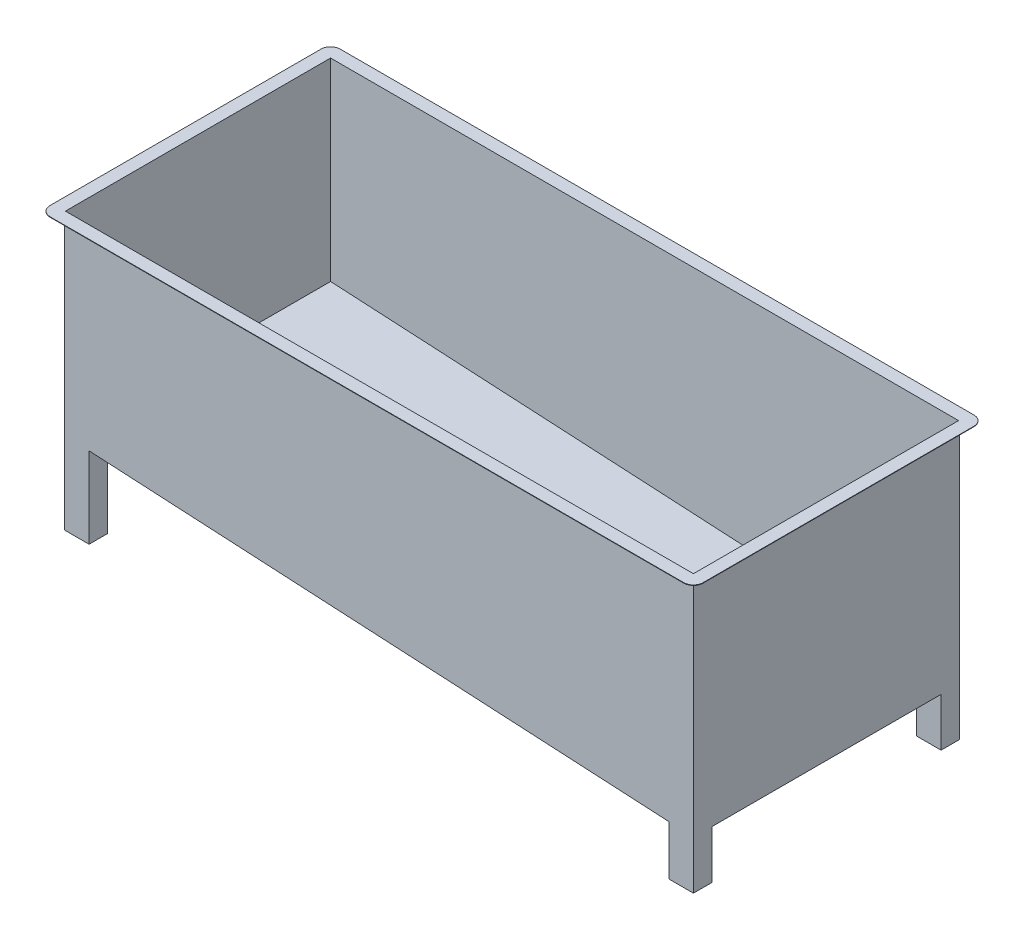
ISO-10303-21;
HEADER;
FILE_DESCRIPTION(('STEP AP214'),'2;1');
FILE_NAME('part.step','',(''),(''),'','','');
FILE_SCHEMA(('AUTOMOTIVE_DESIGN { 1 0 10303 214 1 1 1 1 }'));
ENDSEC;
DATA;
#1=APPLICATION_CONTEXT('core data for automotive mechanical design processes');
#2=APPLICATION_PROTOCOL_DEFINITION('international standard','automotive_design',2000,#1);
#3=PRODUCT_CONTEXT('',#1,'mechanical');
#4=PRODUCT('Part','Part','',(#3));
#5=PRODUCT_RELATED_PRODUCT_CATEGORY('part','',(#4));
#6=PRODUCT_DEFINITION_FORMATION('','',#4);
#7=PRODUCT_DEFINITION_CONTEXT('part definition',#1,'design');
#8=PRODUCT_DEFINITION('design','',#6,#7);
#9=PRODUCT_DEFINITION_SHAPE('','',#8);
#10=(LENGTH_UNIT() NAMED_UNIT(*) SI_UNIT(.MILLI.,.METRE.));
#11=(NAMED_UNIT(*) PLANE_ANGLE_UNIT() SI_UNIT($,.RADIAN.));
#12=(NAMED_UNIT(*) SI_UNIT($,.STERADIAN.) SOLID_ANGLE_UNIT());
#13=UNCERTAINTY_MEASURE_WITH_UNIT(LENGTH_MEASURE(1.E-05),#10,'distance_accuracy_value','');
#14=(GEOMETRIC_REPRESENTATION_CONTEXT(3) GLOBAL_UNCERTAINTY_ASSIGNED_CONTEXT((#13)) GLOBAL_UNIT_ASSIGNED_CONTEXT((#10,
#11,#12)) REPRESENTATION_CONTEXT('',''));
#15=CARTESIAN_POINT('',(0.,0.,0.));
#16=DIRECTION('',(0.,0.,1.));
#17=DIRECTION('',(1.,0.,0.));
#18=AXIS2_PLACEMENT_3D('',#15,#16,#17);
#19=CARTESIAN_POINT('',(1300.,0.,3153.76650258813));
#20=DIRECTION('',(0.0537682621928045,0.998553440723513,0.));
#21=DIRECTION('',(-0.998553440723513,0.0537682621928045,0.));
#22=AXIS2_PLACEMENT_3D('',#19,#20,#21);
#23=PLANE('',#22);
#24=CARTESIAN_POINT('',(1250.,2.69230769230772,300.));
#25=DIRECTION('',(0.0537682621928045,0.998553440723513,0.));
#26=DIRECTION('',(0.998553440723513,-0.0537682621928045,0.));
#27=AXIS2_PLACEMENT_3D('',#24,#25,#26);
#28=ELLIPSE('',#27,12.718397916488,12.6999999999999);
#29=CARTESIAN_POINT('',(1262.7,2.00846153846157,300.));
#30=VERTEX_POINT('',#29);
#31=EDGE_CURVE('E441',#30,#30,#28,.T.);
#32=ORIENTED_EDGE('',*,*,#31,.T.);
#33=EDGE_LOOP('',(#32));
#34=FACE_BOUND('',#33,.T.);
#35=CARTESIAN_POINT('',(1250.,2.69230769230772,0.));
#36=DIRECTION('',(0.0537682621928045,0.998553440723513,0.));
#37=DIRECTION('',(0.998553440723513,-0.0537682621928045,0.));
#38=AXIS2_PLACEMENT_3D('',#35,#36,#37);
#39=ELLIPSE('',#38,12.718397916488,12.6999999999999);
#40=CARTESIAN_POINT('',(1262.7,2.00846153846157,0.));
#41=VERTEX_POINT('',#40);
#42=EDGE_CURVE('E252',#41,#41,#39,.T.);
#43=ORIENTED_EDGE('',*,*,#42,.T.);
#44=EDGE_LOOP('',(#43));
#45=FACE_BOUND('',#44,.T.);
#46=DIRECTION('',(-0.998553440723513,0.0537682621928045,0.));
#47=VECTOR('',#46,1.);
#48=CARTESIAN_POINT('',(1300.,0.,550.));
#49=LINE('',#48,#47);
#50=CARTESIAN_POINT('',(1198.4,5.47076923076924,550.));
#51=VERTEX_POINT('',#50);
#52=CARTESIAN_POINT('',(-1198.4,134.529230769231,550.));
#53=VERTEX_POINT('',#52);
#54=EDGE_CURVE('E57',#51,#53,#49,.T.);
#55=ORIENTED_EDGE('',*,*,#54,.T.);
#56=DIRECTION('',(0.,0.,1.));
#57=VECTOR('',#56,1.);
#58=CARTESIAN_POINT('',(-1198.4,134.529230769231,473.8));
#59=LINE('',#58,#57);
#60=CARTESIAN_POINT('',(-1198.4,134.529230769231,473.8));
#61=VERTEX_POINT('',#60);
#62=EDGE_CURVE('E52',#61,#53,#59,.T.);
#63=ORIENTED_EDGE('',*,*,#62,.F.);
#64=DIRECTION('',(-0.998553440723513,0.0537682621928045,0.));
#65=VECTOR('',#64,1.);
#66=CARTESIAN_POINT('',(-1198.4,134.529230769231,473.8));
#67=LINE('',#66,#65);
#68=CARTESIAN_POINT('',(-1300.,140.,473.8));
#69=VERTEX_POINT('',#68);
#70=EDGE_CURVE('E232',#61,#69,#67,.T.);
#71=ORIENTED_EDGE('',*,*,#70,.T.);
#72=DIRECTION('',(0.,0.,-1.));
#73=VECTOR('',#72,1.);
#74=CARTESIAN_POINT('',(-1300.,140.,3153.76650258813));
#75=LINE('',#74,#73);
#76=CARTESIAN_POINT('',(-1300.,140.,-473.8));
#77=VERTEX_POINT('',#76);
#78=EDGE_CURVE('E222',#69,#77,#75,.T.);
#79=ORIENTED_EDGE('',*,*,#78,.T.);
#80=DIRECTION('',(0.998553440723513,-0.0537682621928045,0.));
#81=VECTOR('',#80,1.);
#82=CARTESIAN_POINT('',(-1300.,140.,-473.8));
#83=LINE('',#82,#81);
#84=CARTESIAN_POINT('',(-1198.4,134.529230769231,-473.8));
#85=VERTEX_POINT('',#84);
#86=EDGE_CURVE('E284',#77,#85,#83,.T.);
#87=ORIENTED_EDGE('',*,*,#86,.T.);
#88=DIRECTION('',(0.,0.,-1.));
#89=VECTOR('',#88,1.);
#90=CARTESIAN_POINT('',(-1198.4,134.529230769231,-473.8));
#91=LINE('',#90,#89);
#92=CARTESIAN_POINT('',(-1198.4,134.529230769231,-550.));
#93=VERTEX_POINT('',#92);
#94=EDGE_CURVE('E294',#85,#93,#91,.T.);
#95=ORIENTED_EDGE('',*,*,#94,.T.);
#96=DIRECTION('',(0.998553440723513,-0.0537682621928045,0.));
#97=VECTOR('',#96,1.);
#98=CARTESIAN_POINT('',(1300.,0.,-550.));
#99=LINE('',#98,#97);
#100=CARTESIAN_POINT('',(1198.4,5.47076923076923,-550.));
#101=VERTEX_POINT('',#100);
#102=EDGE_CURVE('E230',#93,#101,#99,.T.);
#103=ORIENTED_EDGE('',*,*,#102,.T.);
#104=DIRECTION('',(0.,0.,-1.));
#105=VECTOR('',#104,1.);
#106=CARTESIAN_POINT('',(1198.4,5.47076923076923,-473.8));
#107=LINE('',#106,#105);
#108=CARTESIAN_POINT('',(1198.4,5.47076923076923,-473.8));
#109=VERTEX_POINT('',#108);
#110=EDGE_CURVE('E325',#109,#101,#107,.T.);
#111=ORIENTED_EDGE('',*,*,#110,.F.);
#112=DIRECTION('',(0.998553440723513,-0.0537682621928045,0.));
#113=VECTOR('',#112,1.);
#114=CARTESIAN_POINT('',(1300.,0.,-473.8));
#115=LINE('',#114,#113);
#116=CARTESIAN_POINT('',(1300.,0.,-473.8));
#117=VERTEX_POINT('',#116);
#118=EDGE_CURVE('E307',#109,#117,#115,.T.);
#119=ORIENTED_EDGE('',*,*,#118,.T.);
#120=DIRECTION('',(0.,0.,-1.));
#121=VECTOR('',#120,1.);
#122=CARTESIAN_POINT('',(1300.,0.,550.));
#123=LINE('',#122,#121);
#124=CARTESIAN_POINT('',(1300.,0.,473.8));
#125=VERTEX_POINT('',#124);
#126=EDGE_CURVE('E398',#125,#117,#123,.T.);
#127=ORIENTED_EDGE('',*,*,#126,.F.);
#128=DIRECTION('',(-0.998553440723513,0.0537682621928046,0.));
#129=VECTOR('',#128,1.);
#130=CARTESIAN_POINT('',(1198.4,5.47076923076924,473.8));
#131=LINE('',#130,#129);
#132=CARTESIAN_POINT('',(1198.4,5.47076923076924,473.8));
#133=VERTEX_POINT('',#132);
#134=EDGE_CURVE('E260',#125,#133,#131,.T.);
#135=ORIENTED_EDGE('',*,*,#134,.T.);
#136=DIRECTION('',(0.,0.,1.));
#137=VECTOR('',#136,1.);
#138=CARTESIAN_POINT('',(1198.4,5.47076923076924,473.8));
#139=LINE('',#138,#137);
#140=EDGE_CURVE('E272',#133,#51,#139,.T.);
#141=ORIENTED_EDGE('',*,*,#140,.T.);
#142=EDGE_LOOP('',(#55,#63,#71,#79,#87,#95,#103,#111,#119,#127,#135,#141));
#143=FACE_BOUND('',#142,.T.);
#144=ADVANCED_FACE('F35',(#34,#45,#143),#23,.F.);
#145=CARTESIAN_POINT('',(0.,941.89,0.));
#146=DIRECTION('',(0.,1.,0.));
#147=DIRECTION('',(0.,0.,1.));
#148=AXIS2_PLACEMENT_3D('',#145,#146,#147);
#149=PLANE('',#148);
#150=DIRECTION('',(0.,0.,1.));
#151=VECTOR('',#150,1.);
#152=CARTESIAN_POINT('',(-1298.11,941.89,-548.11));
#153=LINE('',#152,#151);
#154=CARTESIAN_POINT('',(-1298.11,941.89,-548.11));
#155=VERTEX_POINT('',#154);
#156=CARTESIAN_POINT('',(-1298.11,941.89,548.11));
#157=VERTEX_POINT('',#156);
#158=EDGE_CURVE('E380',#155,#157,#153,.T.);
#159=ORIENTED_EDGE('',*,*,#158,.F.);
#160=DIRECTION('',(-1.,0.,0.));
#161=VECTOR('',#160,1.);
#162=CARTESIAN_POINT('',(-1298.11,941.89,-548.11));
#163=LINE('',#162,#161);
#164=CARTESIAN_POINT('',(1298.11,941.89,-548.11));
#165=VERTEX_POINT('',#164);
#166=EDGE_CURVE('E368',#165,#155,#163,.T.);
#167=ORIENTED_EDGE('',*,*,#166,.F.);
#168=DIRECTION('',(0.,0.,-1.));
#169=VECTOR('',#168,1.);
#170=CARTESIAN_POINT('',(1298.11,941.89,-548.11));
#171=LINE('',#170,#169);
#172=CARTESIAN_POINT('',(1298.11,941.89,548.11));
#173=VERTEX_POINT('',#172);
#174=EDGE_CURVE('E385',#173,#165,#171,.T.);
#175=ORIENTED_EDGE('',*,*,#174,.F.);
#176=DIRECTION('',(1.,0.,0.));
#177=VECTOR('',#176,1.);
#178=CARTESIAN_POINT('',(-1298.11,941.89,548.11));
#179=LINE('',#178,#177);
#180=EDGE_CURVE('E382',#157,#173,#179,.T.);
#181=ORIENTED_EDGE('',*,*,#180,.F.);
#182=EDGE_LOOP('',(#159,#167,#175,#181));
#183=FACE_BOUND('',#182,.T.);
#184=DIRECTION('',(-1.,0.,0.));
#185=VECTOR('',#184,1.);
#186=CARTESIAN_POINT('',(-1350.,941.89,-600.));
#187=LINE('',#186,#185);
#188=CARTESIAN_POINT('',(1310.,941.89,-600.));
#189=VERTEX_POINT('',#188);
#190=CARTESIAN_POINT('',(-1310.,941.89,-600.));
#191=VERTEX_POINT('',#190);
#192=EDGE_CURVE('E354',#189,#191,#187,.T.);
#193=ORIENTED_EDGE('',*,*,#192,.T.);
#194=CARTESIAN_POINT('',(-1310.,941.89,-560.));
#195=DIRECTION('',(0.,1.,0.));
#196=DIRECTION('',(0.,0.,1.));
#197=AXIS2_PLACEMENT_3D('',#194,#195,#196);
#198=CIRCLE('',#197,40.);
#199=CARTESIAN_POINT('',(-1350.,941.89,-560.));
#200=VERTEX_POINT('',#199);
#201=EDGE_CURVE('E419',#191,#200,#198,.T.);
#202=ORIENTED_EDGE('',*,*,#201,.T.);
#203=DIRECTION('',(0.,0.,1.));
#204=VECTOR('',#203,1.);
#205=CARTESIAN_POINT('',(-1350.,941.89,-600.));
#206=LINE('',#205,#204);
#207=CARTESIAN_POINT('',(-1350.,941.89,560.));
#208=VERTEX_POINT('',#207);
#209=EDGE_CURVE('E371',#200,#208,#206,.T.);
#210=ORIENTED_EDGE('',*,*,#209,.T.);
#211=CARTESIAN_POINT('',(-1310.,941.89,560.));
#212=DIRECTION('',(0.,1.,0.));
#213=DIRECTION('',(0.,0.,1.));
#214=AXIS2_PLACEMENT_3D('',#211,#212,#213);
#215=CIRCLE('',#214,40.);
#216=CARTESIAN_POINT('',(-1310.,941.89,600.));
#217=VERTEX_POINT('',#216);
#218=EDGE_CURVE('E417',#208,#217,#215,.T.);
#219=ORIENTED_EDGE('',*,*,#218,.T.);
#220=DIRECTION('',(1.,0.,0.));
#221=VECTOR('',#220,1.);
#222=CARTESIAN_POINT('',(-1350.,941.89,600.));
#223=LINE('',#222,#221);
#224=CARTESIAN_POINT('',(1310.,941.89,600.));
#225=VERTEX_POINT('',#224);
#226=EDGE_CURVE('E374',#217,#225,#223,.T.);
#227=ORIENTED_EDGE('',*,*,#226,.T.);
#228=CARTESIAN_POINT('',(1310.,941.89,560.));
#229=DIRECTION('',(0.,1.,0.));
#230=DIRECTION('',(0.,0.,1.));
#231=AXIS2_PLACEMENT_3D('',#228,#229,#230);
#232=CIRCLE('',#231,40.);
#233=CARTESIAN_POINT('',(1350.,941.89,560.));
#234=VERTEX_POINT('',#233);
#235=EDGE_CURVE('E413',#225,#234,#232,.T.);
#236=ORIENTED_EDGE('',*,*,#235,.T.);
#237=DIRECTION('',(0.,0.,-1.));
#238=VECTOR('',#237,1.);
#239=CARTESIAN_POINT('',(1350.,941.89,-600.));
#240=LINE('',#239,#238);
#241=CARTESIAN_POINT('',(1350.,941.89,-560.));
#242=VERTEX_POINT('',#241);
#243=EDGE_CURVE('E359',#234,#242,#240,.T.);
#244=ORIENTED_EDGE('',*,*,#243,.T.);
#245=CARTESIAN_POINT('',(1310.,941.89,-560.));
#246=DIRECTION('',(0.,1.,0.));
#247=DIRECTION('',(0.,0.,1.));
#248=AXIS2_PLACEMENT_3D('',#245,#246,#247);
#249=CIRCLE('',#248,40.);
#250=EDGE_CURVE('E415',#242,#189,#249,.T.);
#251=ORIENTED_EDGE('',*,*,#250,.T.);
#252=EDGE_LOOP('',(#193,#202,#210,#219,#227,#236,#244,#251));
#253=FACE_BOUND('',#252,.T.);
#254=ADVANCED_FACE('F473',(#183,#253),#149,.T.);
#255=CARTESIAN_POINT('',(-1298.11,941.89,-548.11));
#256=DIRECTION('',(0.,0.,1.));
#257=DIRECTION('',(1.,0.,0.));
#258=AXIS2_PLACEMENT_3D('',#255,#256,#257);
#259=PLANE('',#258);
#260=DIRECTION('',(-0.998553440723513,0.0537682621928045,0.));
#261=VECTOR('',#260,1.);
#262=CARTESIAN_POINT('',(-1341.06770360839,144.104075844256,-548.11));
#263=LINE('',#262,#261);
#264=CARTESIAN_POINT('',(1298.11,1.99450718841976,-548.11));
#265=VERTEX_POINT('',#264);
#266=CARTESIAN_POINT('',(-1298.11,141.790968726881,-548.11));
#267=VERTEX_POINT('',#266);
#268=EDGE_CURVE('E341',#265,#267,#263,.T.);
#269=ORIENTED_EDGE('',*,*,#268,.F.);
#270=DIRECTION('',(0.,-1.,0.));
#271=VECTOR('',#270,1.);
#272=CARTESIAN_POINT('',(1298.11,941.89,-548.11));
#273=LINE('',#272,#271);
#274=EDGE_CURVE('E387',#165,#265,#273,.T.);
#275=ORIENTED_EDGE('',*,*,#274,.F.);
#276=ORIENTED_EDGE('',*,*,#166,.T.);
#277=DIRECTION('',(0.,-1.,0.));
#278=VECTOR('',#277,1.);
#279=CARTESIAN_POINT('',(-1298.11,941.89,-548.11));
#280=LINE('',#279,#278);
#281=EDGE_CURVE('E395',#155,#267,#280,.T.);
#282=ORIENTED_EDGE('',*,*,#281,.T.);
#283=EDGE_LOOP('',(#269,#275,#276,#282));
#284=FACE_BOUND('',#283,.T.);
#285=ADVANCED_FACE('F476',(#284),#259,.T.);
#286=CARTESIAN_POINT('',(-1298.11,941.89,-548.11));
#287=DIRECTION('',(1.,0.,0.));
#288=DIRECTION('',(0.,0.,-1.));
#289=AXIS2_PLACEMENT_3D('',#286,#287,#288);
#290=PLANE('',#289);
#291=DIRECTION('',(0.,0.,1.));
#292=VECTOR('',#291,1.);
#293=CARTESIAN_POINT('',(-1298.11,141.790968726881,-548.11));
#294=LINE('',#293,#292);
#295=CARTESIAN_POINT('',(-1298.11,141.790968726881,548.11));
#296=VERTEX_POINT('',#295);
#297=EDGE_CURVE('E338',#267,#296,#294,.T.);
#298=ORIENTED_EDGE('',*,*,#297,.F.);
#299=ORIENTED_EDGE('',*,*,#281,.F.);
#300=ORIENTED_EDGE('',*,*,#158,.T.);
#301=DIRECTION('',(0.,-1.,0.));
#302=VECTOR('',#301,1.);
#303=CARTESIAN_POINT('',(-1298.11,941.89,548.11));
#304=LINE('',#303,#302);
#305=EDGE_CURVE('E392',#157,#296,#304,.T.);
#306=ORIENTED_EDGE('',*,*,#305,.T.);
#307=EDGE_LOOP('',(#298,#299,#300,#306));
#308=FACE_BOUND('',#307,.T.);
#309=ADVANCED_FACE('F479',(#308),#290,.T.);
#310=CARTESIAN_POINT('',(-1298.11,941.89,548.11));
#311=DIRECTION('',(0.,0.,-1.));
#312=DIRECTION('',(-1.,0.,0.));
#313=AXIS2_PLACEMENT_3D('',#310,#311,#312);
#314=PLANE('',#313);
#315=DIRECTION('',(0.998553440723513,-0.0537682621928045,0.));
#316=VECTOR('',#315,1.);
#317=CARTESIAN_POINT('',(-1341.06770360839,144.104075844256,548.11));
#318=LINE('',#317,#316);
#319=CARTESIAN_POINT('',(1298.11,1.99450718841998,548.11));
#320=VERTEX_POINT('',#319);
#321=EDGE_CURVE('E335',#296,#320,#318,.T.);
#322=ORIENTED_EDGE('',*,*,#321,.F.);
#323=ORIENTED_EDGE('',*,*,#305,.F.);
#324=ORIENTED_EDGE('',*,*,#180,.T.);
#325=DIRECTION('',(0.,-1.,0.));
#326=VECTOR('',#325,1.);
#327=CARTESIAN_POINT('',(1298.11,941.89,548.11));
#328=LINE('',#327,#326);
#329=EDGE_CURVE('E389',#173,#320,#328,.T.);
#330=ORIENTED_EDGE('',*,*,#329,.T.);
#331=EDGE_LOOP('',(#322,#323,#324,#330));
#332=FACE_BOUND('',#331,.T.);
#333=ADVANCED_FACE('F466',(#332),#314,.T.);
#334=CARTESIAN_POINT('',(1298.11,941.89,-548.11));
#335=DIRECTION('',(-1.,0.,0.));
#336=DIRECTION('',(0.,0.,1.));
#337=AXIS2_PLACEMENT_3D('',#334,#335,#336);
#338=PLANE('',#337);
#339=DIRECTION('',(0.,0.,-1.));
#340=VECTOR('',#339,1.);
#341=CARTESIAN_POINT('',(1298.11,1.99450718841976,-548.11));
#342=LINE('',#341,#340);
#343=EDGE_CURVE('E328',#320,#265,#342,.T.);
#344=ORIENTED_EDGE('',*,*,#343,.F.);
#345=ORIENTED_EDGE('',*,*,#329,.F.);
#346=ORIENTED_EDGE('',*,*,#174,.T.);
#347=ORIENTED_EDGE('',*,*,#274,.T.);
#348=EDGE_LOOP('',(#344,#345,#346,#347));
#349=FACE_BOUND('',#348,.T.);
#350=ADVANCED_FACE('F463',(#349),#338,.T.);
#351=CARTESIAN_POINT('',(-1350.,940.,-600.));
#352=DIRECTION('',(0.,0.,-1.));
#353=DIRECTION('',(-1.,0.,0.));
#354=AXIS2_PLACEMENT_3D('',#351,#352,#353);
#355=PLANE('',#354);
#356=DIRECTION('',(-1.,0.,0.));
#357=VECTOR('',#356,1.);
#358=CARTESIAN_POINT('',(-1350.,940.,-600.));
#359=LINE('',#358,#357);
#360=CARTESIAN_POINT('',(1310.,940.,-600.));
#361=VERTEX_POINT('',#360);
#362=CARTESIAN_POINT('',(-1310.,940.,-600.));
#363=VERTEX_POINT('',#362);
#364=EDGE_CURVE('E355',#361,#363,#359,.T.);
#365=ORIENTED_EDGE('',*,*,#364,.T.);
#366=DIRECTION('',(0.,1.,0.));
#367=VECTOR('',#366,1.);
#368=CARTESIAN_POINT('',(-1310.,940.,-600.));
#369=LINE('',#368,#367);
#370=EDGE_CURVE('E410',#363,#191,#369,.T.);
#371=ORIENTED_EDGE('',*,*,#370,.T.);
#372=ORIENTED_EDGE('',*,*,#192,.F.);
#373=DIRECTION('',(0.,1.,0.));
#374=VECTOR('',#373,1.);
#375=CARTESIAN_POINT('',(1310.,940.,-600.));
#376=LINE('',#375,#374);
#377=EDGE_CURVE('E408',#189,#361,#376,.F.);
#378=ORIENTED_EDGE('',*,*,#377,.T.);
#379=EDGE_LOOP('',(#365,#371,#372,#378));
#380=FACE_BOUND('',#379,.T.);
#381=ADVANCED_FACE('F507',(#380),#355,.T.);
#382=CARTESIAN_POINT('',(1350.,940.,-600.));
#383=DIRECTION('',(1.,0.,0.));
#384=DIRECTION('',(0.,0.,-1.));
#385=AXIS2_PLACEMENT_3D('',#382,#383,#384);
#386=PLANE('',#385);
#387=DIRECTION('',(0.,0.,-1.));
#388=VECTOR('',#387,1.);
#389=CARTESIAN_POINT('',(1350.,940.,-600.));
#390=LINE('',#389,#388);
#391=CARTESIAN_POINT('',(1350.,940.,560.));
#392=VERTEX_POINT('',#391);
#393=CARTESIAN_POINT('',(1350.,940.,-560.));
#394=VERTEX_POINT('',#393);
#395=EDGE_CURVE('E365',#392,#394,#390,.T.);
#396=ORIENTED_EDGE('',*,*,#395,.T.);
#397=DIRECTION('',(0.,1.,0.));
#398=VECTOR('',#397,1.);
#399=CARTESIAN_POINT('',(1350.,940.,-560.));
#400=LINE('',#399,#398);
#401=EDGE_CURVE('E11',#394,#242,#400,.T.);
#402=ORIENTED_EDGE('',*,*,#401,.T.);
#403=ORIENTED_EDGE('',*,*,#243,.F.);
#404=DIRECTION('',(0.,1.,0.));
#405=VECTOR('',#404,1.);
#406=CARTESIAN_POINT('',(1350.,940.,560.));
#407=LINE('',#406,#405);
#408=EDGE_CURVE('E44',#234,#392,#407,.F.);
#409=ORIENTED_EDGE('',*,*,#408,.T.);
#410=EDGE_LOOP('',(#396,#402,#403,#409));
#411=FACE_BOUND('',#410,.T.);
#412=ADVANCED_FACE('F503',(#411),#386,.T.);
#413=CARTESIAN_POINT('',(-1350.,940.,600.));
#414=DIRECTION('',(0.,0.,1.));
#415=DIRECTION('',(1.,0.,0.));
#416=AXIS2_PLACEMENT_3D('',#413,#414,#415);
#417=PLANE('',#416);
#418=ORIENTED_EDGE('',*,*,#226,.F.);
#419=DIRECTION('',(0.,1.,0.));
#420=VECTOR('',#419,1.);
#421=CARTESIAN_POINT('',(-1310.,940.,600.));
#422=LINE('',#421,#420);
#423=CARTESIAN_POINT('',(-1310.,940.,600.));
#424=VERTEX_POINT('',#423);
#425=EDGE_CURVE('E437',#217,#424,#422,.F.);
#426=ORIENTED_EDGE('',*,*,#425,.T.);
#427=DIRECTION('',(1.,0.,0.));
#428=VECTOR('',#427,1.);
#429=CARTESIAN_POINT('',(-1350.,940.,600.));
#430=LINE('',#429,#428);
#431=CARTESIAN_POINT('',(1310.,940.,600.));
#432=VERTEX_POINT('',#431);
#433=EDGE_CURVE('E362',#424,#432,#430,.T.);
#434=ORIENTED_EDGE('',*,*,#433,.T.);
#435=DIRECTION('',(0.,1.,0.));
#436=VECTOR('',#435,1.);
#437=CARTESIAN_POINT('',(1310.,940.,600.));
#438=LINE('',#437,#436);
#439=EDGE_CURVE('E434',#432,#225,#438,.T.);
#440=ORIENTED_EDGE('',*,*,#439,.T.);
#441=EDGE_LOOP('',(#418,#426,#434,#440));
#442=FACE_BOUND('',#441,.T.);
#443=ADVANCED_FACE('F506',(#442),#417,.T.);
#444=CARTESIAN_POINT('',(-1350.,940.,-600.));
#445=DIRECTION('',(-1.,0.,0.));
#446=DIRECTION('',(0.,0.,1.));
#447=AXIS2_PLACEMENT_3D('',#444,#445,#446);
#448=PLANE('',#447);
#449=ORIENTED_EDGE('',*,*,#209,.F.);
#450=DIRECTION('',(0.,1.,0.));
#451=VECTOR('',#450,1.);
#452=CARTESIAN_POINT('',(-1350.,940.,-560.));
#453=LINE('',#452,#451);
#454=CARTESIAN_POINT('',(-1350.,940.,-560.));
#455=VERTEX_POINT('',#454);
#456=EDGE_CURVE('E424',#200,#455,#453,.F.);
#457=ORIENTED_EDGE('',*,*,#456,.T.);
#458=DIRECTION('',(0.,0.,1.));
#459=VECTOR('',#458,1.);
#460=CARTESIAN_POINT('',(-1350.,940.,-600.));
#461=LINE('',#460,#459);
#462=CARTESIAN_POINT('',(-1350.,940.,560.));
#463=VERTEX_POINT('',#462);
#464=EDGE_CURVE('E358',#455,#463,#461,.T.);
#465=ORIENTED_EDGE('',*,*,#464,.T.);
#466=DIRECTION('',(0.,1.,0.));
#467=VECTOR('',#466,1.);
#468=CARTESIAN_POINT('',(-1350.,940.,560.));
#469=LINE('',#468,#467);
#470=EDGE_CURVE('E421',#463,#208,#469,.T.);
#471=ORIENTED_EDGE('',*,*,#470,.T.);
#472=EDGE_LOOP('',(#449,#457,#465,#471));
#473=FACE_BOUND('',#472,.T.);
#474=ADVANCED_FACE('F501',(#473),#448,.T.);
#475=CARTESIAN_POINT('',(0.,940.,0.));
#476=DIRECTION('',(0.,-1.,0.));
#477=DIRECTION('',(0.,0.,-1.));
#478=AXIS2_PLACEMENT_3D('',#475,#476,#477);
#479=PLANE('',#478);
#480=DIRECTION('',(0.,0.,1.));
#481=VECTOR('',#480,1.);
#482=CARTESIAN_POINT('',(-1300.,940.,-550.));
#483=LINE('',#482,#481);
#484=CARTESIAN_POINT('',(-1300.,940.,-550.));
#485=VERTEX_POINT('',#484);
#486=CARTESIAN_POINT('',(-1300.,940.,550.));
#487=VERTEX_POINT('',#486);
#488=EDGE_CURVE('E345',#485,#487,#483,.T.);
#489=ORIENTED_EDGE('',*,*,#488,.T.);
#490=DIRECTION('',(1.,0.,0.));
#491=VECTOR('',#490,1.);
#492=CARTESIAN_POINT('',(-1300.,940.,550.));
#493=LINE('',#492,#491);
#494=CARTESIAN_POINT('',(1300.,940.,550.));
#495=VERTEX_POINT('',#494);
#496=EDGE_CURVE('E348',#487,#495,#493,.T.);
#497=ORIENTED_EDGE('',*,*,#496,.T.);
#498=DIRECTION('',(0.,0.,-1.));
#499=VECTOR('',#498,1.);
#500=CARTESIAN_POINT('',(1300.,940.,-550.));
#501=LINE('',#500,#499);
#502=CARTESIAN_POINT('',(1300.,940.,-550.));
#503=VERTEX_POINT('',#502);
#504=EDGE_CURVE('E350',#495,#503,#501,.T.);
#505=ORIENTED_EDGE('',*,*,#504,.T.);
#506=DIRECTION('',(-1.,0.,0.));
#507=VECTOR('',#506,1.);
#508=CARTESIAN_POINT('',(-1300.,940.,-550.));
#509=LINE('',#508,#507);
#510=EDGE_CURVE('E352',#503,#485,#509,.T.);
#511=ORIENTED_EDGE('',*,*,#510,.T.);
#512=EDGE_LOOP('',(#489,#497,#505,#511));
#513=FACE_BOUND('',#512,.T.);
#514=ORIENTED_EDGE('',*,*,#464,.F.);
#515=CARTESIAN_POINT('',(-1310.,940.,-560.));
#516=DIRECTION('',(0.,-1.,0.));
#517=DIRECTION('',(0.,0.,-1.));
#518=AXIS2_PLACEMENT_3D('',#515,#516,#517);
#519=CIRCLE('',#518,40.);
#520=EDGE_CURVE('E432',#455,#363,#519,.T.);
#521=ORIENTED_EDGE('',*,*,#520,.T.);
#522=ORIENTED_EDGE('',*,*,#364,.F.);
#523=CARTESIAN_POINT('',(1310.,940.,-560.));
#524=DIRECTION('',(0.,-1.,0.));
#525=DIRECTION('',(0.,0.,-1.));
#526=AXIS2_PLACEMENT_3D('',#523,#524,#525);
#527=CIRCLE('',#526,40.);
#528=EDGE_CURVE('E428',#361,#394,#527,.T.);
#529=ORIENTED_EDGE('',*,*,#528,.T.);
#530=ORIENTED_EDGE('',*,*,#395,.F.);
#531=CARTESIAN_POINT('',(1310.,940.,560.));
#532=DIRECTION('',(0.,-1.,0.));
#533=DIRECTION('',(0.,0.,-1.));
#534=AXIS2_PLACEMENT_3D('',#531,#532,#533);
#535=CIRCLE('',#534,40.);
#536=EDGE_CURVE('E426',#392,#432,#535,.T.);
#537=ORIENTED_EDGE('',*,*,#536,.T.);
#538=ORIENTED_EDGE('',*,*,#433,.F.);
#539=CARTESIAN_POINT('',(-1310.,940.,560.));
#540=DIRECTION('',(0.,-1.,0.));
#541=DIRECTION('',(0.,0.,-1.));
#542=AXIS2_PLACEMENT_3D('',#539,#540,#541);
#543=CIRCLE('',#542,40.);
#544=EDGE_CURVE('E430',#424,#463,#543,.T.);
#545=ORIENTED_EDGE('',*,*,#544,.T.);
#546=EDGE_LOOP('',(#514,#521,#522,#529,#530,#537,#538,#545));
#547=FACE_BOUND('',#546,.T.);
#548=ADVANCED_FACE('F497',(#513,#547),#479,.T.);
#549=CARTESIAN_POINT('',(-1300.,1.89,550.));
#550=DIRECTION('',(0.,0.,-1.));
#551=DIRECTION('',(-1.,0.,0.));
#552=AXIS2_PLACEMENT_3D('',#549,#550,#551);
#553=PLANE('',#552);
#554=DIRECTION('',(0.,-1.,0.));
#555=VECTOR('',#554,1.);
#556=CARTESIAN_POINT('',(-1300.,1.89,550.));
#557=LINE('',#556,#555);
#558=CARTESIAN_POINT('',(-1300.,-200.,550.));
#559=VERTEX_POINT('',#558);
#560=EDGE_CURVE('E402',#487,#559,#557,.T.);
#561=ORIENTED_EDGE('',*,*,#560,.T.);
#562=DIRECTION('',(1.,0.,0.));
#563=VECTOR('',#562,1.);
#564=CARTESIAN_POINT('',(-1300.,-200.,550.));
#565=LINE('',#564,#563);
#566=CARTESIAN_POINT('',(-1198.4,-200.,550.));
#567=VERTEX_POINT('',#566);
#568=EDGE_CURVE('E249',#559,#567,#565,.T.);
#569=ORIENTED_EDGE('',*,*,#568,.T.);
#570=DIRECTION('',(0.,1.,0.));
#571=VECTOR('',#570,1.);
#572=CARTESIAN_POINT('',(-1198.4,-200.,550.));
#573=LINE('',#572,#571);
#574=EDGE_CURVE('E236',#567,#53,#573,.T.);
#575=ORIENTED_EDGE('',*,*,#574,.T.);
#576=ORIENTED_EDGE('',*,*,#54,.F.);
#577=DIRECTION('',(0.,-1.,0.));
#578=VECTOR('',#577,1.);
#579=CARTESIAN_POINT('',(1198.4,-200.,550.));
#580=LINE('',#579,#578);
#581=CARTESIAN_POINT('',(1198.4,-200.,550.));
#582=VERTEX_POINT('',#581);
#583=EDGE_CURVE('E256',#51,#582,#580,.T.);
#584=ORIENTED_EDGE('',*,*,#583,.T.);
#585=DIRECTION('',(1.,0.,0.));
#586=VECTOR('',#585,1.);
#587=CARTESIAN_POINT('',(1300.,-200.,550.));
#588=LINE('',#587,#586);
#589=CARTESIAN_POINT('',(1300.,-200.,550.));
#590=VERTEX_POINT('',#589);
#591=EDGE_CURVE('E264',#582,#590,#588,.T.);
#592=ORIENTED_EDGE('',*,*,#591,.T.);
#593=DIRECTION('',(0.,-1.,0.));
#594=VECTOR('',#593,1.);
#595=CARTESIAN_POINT('',(1300.,1.89,550.));
#596=LINE('',#595,#594);
#597=EDGE_CURVE('E400',#495,#590,#596,.T.);
#598=ORIENTED_EDGE('',*,*,#597,.F.);
#599=ORIENTED_EDGE('',*,*,#496,.F.);
#600=EDGE_LOOP('',(#561,#569,#575,#576,#584,#592,#598,#599));
#601=FACE_BOUND('',#600,.T.);
#602=ADVANCED_FACE('F500',(#601),#553,.F.);
#603=CARTESIAN_POINT('',(-1300.,1.89,550.));
#604=DIRECTION('',(1.,0.,0.));
#605=DIRECTION('',(0.,0.,-1.));
#606=AXIS2_PLACEMENT_3D('',#603,#604,#605);
#607=PLANE('',#606);
#608=DIRECTION('',(0.,-1.,0.));
#609=VECTOR('',#608,1.);
#610=CARTESIAN_POINT('',(-1300.,1.89,-550.));
#611=LINE('',#610,#609);
#612=CARTESIAN_POINT('',(-1300.,-200.,-550.));
#613=VERTEX_POINT('',#612);
#614=EDGE_CURVE('E404',#485,#613,#611,.T.);
#615=ORIENTED_EDGE('',*,*,#614,.T.);
#616=DIRECTION('',(0.,0.,-1.));
#617=VECTOR('',#616,1.);
#618=CARTESIAN_POINT('',(-1300.,-200.,-473.8));
#619=LINE('',#618,#617);
#620=CARTESIAN_POINT('',(-1300.,-200.,-473.8));
#621=VERTEX_POINT('',#620);
#622=EDGE_CURVE('E299',#621,#613,#619,.T.);
#623=ORIENTED_EDGE('',*,*,#622,.F.);
#624=DIRECTION('',(0.,1.,0.));
#625=VECTOR('',#624,1.);
#626=CARTESIAN_POINT('',(-1300.,140.,-473.8));
#627=LINE('',#626,#625);
#628=EDGE_CURVE('E228',#621,#77,#627,.T.);
#629=ORIENTED_EDGE('',*,*,#628,.T.);
#630=ORIENTED_EDGE('',*,*,#78,.F.);
#631=DIRECTION('',(0.,-1.,0.));
#632=VECTOR('',#631,1.);
#633=CARTESIAN_POINT('',(-1300.,140.,473.8));
#634=LINE('',#633,#632);
#635=CARTESIAN_POINT('',(-1300.,-200.,473.8));
#636=VERTEX_POINT('',#635);
#637=EDGE_CURVE('E226',#69,#636,#634,.T.);
#638=ORIENTED_EDGE('',*,*,#637,.T.);
#639=DIRECTION('',(0.,0.,1.));
#640=VECTOR('',#639,1.);
#641=CARTESIAN_POINT('',(-1300.,-200.,473.8));
#642=LINE('',#641,#640);
#643=EDGE_CURVE('E248',#636,#559,#642,.T.);
#644=ORIENTED_EDGE('',*,*,#643,.T.);
#645=ORIENTED_EDGE('',*,*,#560,.F.);
#646=ORIENTED_EDGE('',*,*,#488,.F.);
#647=EDGE_LOOP('',(#615,#623,#629,#630,#638,#644,#645,#646));
#648=FACE_BOUND('',#647,.T.);
#649=ADVANCED_FACE('F223',(#648),#607,.F.);
#650=CARTESIAN_POINT('',(-1300.,1.89,-550.));
#651=DIRECTION('',(0.,0.,1.));
#652=DIRECTION('',(1.,0.,0.));
#653=AXIS2_PLACEMENT_3D('',#650,#651,#652);
#654=PLANE('',#653);
#655=DIRECTION('',(0.,-1.,0.));
#656=VECTOR('',#655,1.);
#657=CARTESIAN_POINT('',(1300.,1.89,-550.));
#658=LINE('',#657,#656);
#659=CARTESIAN_POINT('',(1300.,-200.,-550.));
#660=VERTEX_POINT('',#659);
#661=EDGE_CURVE('E406',#503,#660,#658,.T.);
#662=ORIENTED_EDGE('',*,*,#661,.T.);
#663=DIRECTION('',(-1.,0.,0.));
#664=VECTOR('',#663,1.);
#665=CARTESIAN_POINT('',(1300.,-200.,-550.));
#666=LINE('',#665,#664);
#667=CARTESIAN_POINT('',(1198.4,-200.,-550.));
#668=VERTEX_POINT('',#667);
#669=EDGE_CURVE('E302',#660,#668,#666,.T.);
#670=ORIENTED_EDGE('',*,*,#669,.T.);
#671=DIRECTION('',(0.,1.,0.));
#672=VECTOR('',#671,1.);
#673=CARTESIAN_POINT('',(1198.4,-200.,-550.));
#674=LINE('',#673,#672);
#675=EDGE_CURVE('E311',#668,#101,#674,.T.);
#676=ORIENTED_EDGE('',*,*,#675,.T.);
#677=ORIENTED_EDGE('',*,*,#102,.F.);
#678=DIRECTION('',(0.,-1.,0.));
#679=VECTOR('',#678,1.);
#680=CARTESIAN_POINT('',(-1198.4,-200.,-550.));
#681=LINE('',#680,#679);
#682=CARTESIAN_POINT('',(-1198.4,-200.,-550.));
#683=VERTEX_POINT('',#682);
#684=EDGE_CURVE('E280',#93,#683,#681,.T.);
#685=ORIENTED_EDGE('',*,*,#684,.T.);
#686=DIRECTION('',(-1.,0.,0.));
#687=VECTOR('',#686,1.);
#688=CARTESIAN_POINT('',(-1198.4,-200.,-550.));
#689=LINE('',#688,#687);
#690=EDGE_CURVE('E287',#683,#613,#689,.T.);
#691=ORIENTED_EDGE('',*,*,#690,.T.);
#692=ORIENTED_EDGE('',*,*,#614,.F.);
#693=ORIENTED_EDGE('',*,*,#510,.F.);
#694=EDGE_LOOP('',(#662,#670,#676,#677,#685,#691,#692,#693));
#695=FACE_BOUND('',#694,.T.);
#696=ADVANCED_FACE('F560',(#695),#654,.F.);
#697=CARTESIAN_POINT('',(1300.,1.89,550.));
#698=DIRECTION('',(-1.,0.,0.));
#699=DIRECTION('',(0.,0.,1.));
#700=AXIS2_PLACEMENT_3D('',#697,#698,#699);
#701=PLANE('',#700);
#702=ORIENTED_EDGE('',*,*,#597,.T.);
#703=DIRECTION('',(0.,0.,1.));
#704=VECTOR('',#703,1.);
#705=CARTESIAN_POINT('',(1300.,-200.,473.8));
#706=LINE('',#705,#704);
#707=CARTESIAN_POINT('',(1300.,-200.,473.8));
#708=VERTEX_POINT('',#707);
#709=EDGE_CURVE('E277',#708,#590,#706,.T.);
#710=ORIENTED_EDGE('',*,*,#709,.F.);
#711=DIRECTION('',(0.,1.,0.));
#712=VECTOR('',#711,1.);
#713=CARTESIAN_POINT('',(1300.,0.,473.8));
#714=LINE('',#713,#712);
#715=EDGE_CURVE('E270',#708,#125,#714,.T.);
#716=ORIENTED_EDGE('',*,*,#715,.T.);
#717=ORIENTED_EDGE('',*,*,#126,.T.);
#718=DIRECTION('',(0.,-1.,0.));
#719=VECTOR('',#718,1.);
#720=CARTESIAN_POINT('',(1300.,0.,-473.8));
#721=LINE('',#720,#719);
#722=CARTESIAN_POINT('',(1300.,-200.,-473.8));
#723=VERTEX_POINT('',#722);
#724=EDGE_CURVE('E310',#117,#723,#721,.T.);
#725=ORIENTED_EDGE('',*,*,#724,.T.);
#726=DIRECTION('',(0.,0.,-1.));
#727=VECTOR('',#726,1.);
#728=CARTESIAN_POINT('',(1300.,-200.,-473.8));
#729=LINE('',#728,#727);
#730=EDGE_CURVE('E320',#723,#660,#729,.T.);
#731=ORIENTED_EDGE('',*,*,#730,.T.);
#732=ORIENTED_EDGE('',*,*,#661,.F.);
#733=ORIENTED_EDGE('',*,*,#504,.F.);
#734=EDGE_LOOP('',(#702,#710,#716,#717,#725,#731,#732,#733));
#735=FACE_BOUND('',#734,.T.);
#736=ADVANCED_FACE('F567',(#735),#701,.F.);
#737=CARTESIAN_POINT('',(-1310.,940.,-560.));
#738=DIRECTION('',(0.,1.,0.));
#739=DIRECTION('',(0.,0.,1.));
#740=AXIS2_PLACEMENT_3D('',#737,#738,#739);
#741=CYLINDRICAL_SURFACE('',#740,40.);
#742=ORIENTED_EDGE('',*,*,#520,.F.);
#743=ORIENTED_EDGE('',*,*,#456,.F.);
#744=ORIENTED_EDGE('',*,*,#201,.F.);
#745=ORIENTED_EDGE('',*,*,#370,.F.);
#746=EDGE_LOOP('',(#742,#743,#744,#745));
#747=FACE_BOUND('',#746,.T.);
#748=ADVANCED_FACE('F575',(#747),#741,.T.);
#749=CARTESIAN_POINT('',(-1310.,940.,560.));
#750=DIRECTION('',(0.,1.,0.));
#751=DIRECTION('',(0.,0.,1.));
#752=AXIS2_PLACEMENT_3D('',#749,#750,#751);
#753=CYLINDRICAL_SURFACE('',#752,40.);
#754=ORIENTED_EDGE('',*,*,#544,.F.);
#755=ORIENTED_EDGE('',*,*,#425,.F.);
#756=ORIENTED_EDGE('',*,*,#218,.F.);
#757=ORIENTED_EDGE('',*,*,#470,.F.);
#758=EDGE_LOOP('',(#754,#755,#756,#757));
#759=FACE_BOUND('',#758,.T.);
#760=ADVANCED_FACE('F583',(#759),#753,.T.);
#761=CARTESIAN_POINT('',(1310.,940.,-560.));
#762=DIRECTION('',(0.,1.,0.));
#763=DIRECTION('',(0.,0.,1.));
#764=AXIS2_PLACEMENT_3D('',#761,#762,#763);
#765=CYLINDRICAL_SURFACE('',#764,40.);
#766=ORIENTED_EDGE('',*,*,#528,.F.);
#767=ORIENTED_EDGE('',*,*,#377,.F.);
#768=ORIENTED_EDGE('',*,*,#250,.F.);
#769=ORIENTED_EDGE('',*,*,#401,.F.);
#770=EDGE_LOOP('',(#766,#767,#768,#769));
#771=FACE_BOUND('',#770,.T.);
#772=ADVANCED_FACE('F591',(#771),#765,.T.);
#773=CARTESIAN_POINT('',(1310.,940.,560.));
#774=DIRECTION('',(0.,1.,0.));
#775=DIRECTION('',(0.,0.,1.));
#776=AXIS2_PLACEMENT_3D('',#773,#774,#775);
#777=CYLINDRICAL_SURFACE('',#776,40.);
#778=ORIENTED_EDGE('',*,*,#536,.F.);
#779=ORIENTED_EDGE('',*,*,#408,.F.);
#780=ORIENTED_EDGE('',*,*,#235,.F.);
#781=ORIENTED_EDGE('',*,*,#439,.F.);
#782=EDGE_LOOP('',(#778,#779,#780,#781));
#783=FACE_BOUND('',#782,.T.);
#784=ADVANCED_FACE('F37',(#783),#777,.T.);
#785=CARTESIAN_POINT('',(1300.,1.89273795765058,3153.8689577406));
#786=DIRECTION('',(0.0537682621928045,0.998553440723513,0.));
#787=DIRECTION('',(-0.998553440723513,0.0537682621928045,0.));
#788=AXIS2_PLACEMENT_3D('',#785,#786,#787);
#789=PLANE('',#788);
#790=CARTESIAN_POINT('',(1250.,4.58504564995832,300.));
#791=DIRECTION('',(0.0537682621928045,0.998553440723513,0.));
#792=DIRECTION('',(0.998553440723513,-0.0537682621928045,0.));
#793=AXIS2_PLACEMENT_3D('',#790,#791,#792);
#794=ELLIPSE('',#793,12.718397916488,12.6999999999999);
#795=CARTESIAN_POINT('',(1262.7,3.90119949611217,300.));
#796=VERTEX_POINT('',#795);
#797=EDGE_CURVE('E39',#796,#796,#794,.T.);
#798=ORIENTED_EDGE('',*,*,#797,.F.);
#799=EDGE_LOOP('',(#798));
#800=FACE_BOUND('',#799,.T.);
#801=CARTESIAN_POINT('',(1250.,4.58504564995832,0.));
#802=DIRECTION('',(0.0537682621928045,0.998553440723513,0.));
#803=DIRECTION('',(0.998553440723513,-0.0537682621928045,0.));
#804=AXIS2_PLACEMENT_3D('',#801,#802,#803);
#805=ELLIPSE('',#804,12.718397916488,12.6999999999999);
#806=CARTESIAN_POINT('',(1262.7,3.90119949611217,0.));
#807=VERTEX_POINT('',#806);
#808=EDGE_CURVE('E439',#807,#807,#805,.T.);
#809=ORIENTED_EDGE('',*,*,#808,.F.);
#810=EDGE_LOOP('',(#809));
#811=FACE_BOUND('',#810,.T.);
#812=ORIENTED_EDGE('',*,*,#343,.T.);
#813=ORIENTED_EDGE('',*,*,#268,.T.);
#814=ORIENTED_EDGE('',*,*,#297,.T.);
#815=ORIENTED_EDGE('',*,*,#321,.T.);
#816=EDGE_LOOP('',(#812,#813,#814,#815));
#817=FACE_BOUND('',#816,.T.);
#818=ADVANCED_FACE('F455',(#800,#811,#817),#789,.T.);
#819=CARTESIAN_POINT('',(1198.4,-200.,-473.8));
#820=DIRECTION('',(-1.,0.,0.));
#821=DIRECTION('',(0.,0.,1.));
#822=AXIS2_PLACEMENT_3D('',#819,#820,#821);
#823=PLANE('',#822);
#824=ORIENTED_EDGE('',*,*,#675,.F.);
#825=DIRECTION('',(0.,0.,-1.));
#826=VECTOR('',#825,1.);
#827=CARTESIAN_POINT('',(1198.4,-200.,-473.8));
#828=LINE('',#827,#826);
#829=CARTESIAN_POINT('',(1198.4,-200.,-473.8));
#830=VERTEX_POINT('',#829);
#831=EDGE_CURVE('E329',#830,#668,#828,.T.);
#832=ORIENTED_EDGE('',*,*,#831,.F.);
#833=DIRECTION('',(0.,1.,0.));
#834=VECTOR('',#833,1.);
#835=CARTESIAN_POINT('',(1198.4,-200.,-473.8));
#836=LINE('',#835,#834);
#837=EDGE_CURVE('E317',#830,#109,#836,.T.);
#838=ORIENTED_EDGE('',*,*,#837,.T.);
#839=ORIENTED_EDGE('',*,*,#110,.T.);
#840=EDGE_LOOP('',(#824,#832,#838,#839));
#841=FACE_BOUND('',#840,.T.);
#842=ADVANCED_FACE('F458',(#841),#823,.T.);
#843=CARTESIAN_POINT('',(1300.,-200.,-473.8));
#844=DIRECTION('',(0.,-1.,0.));
#845=DIRECTION('',(0.,0.,-1.));
#846=AXIS2_PLACEMENT_3D('',#843,#844,#845);
#847=PLANE('',#846);
#848=ORIENTED_EDGE('',*,*,#669,.F.);
#849=ORIENTED_EDGE('',*,*,#730,.F.);
#850=DIRECTION('',(-1.,0.,0.));
#851=VECTOR('',#850,1.);
#852=CARTESIAN_POINT('',(1300.,-200.,-473.8));
#853=LINE('',#852,#851);
#854=EDGE_CURVE('E314',#723,#830,#853,.T.);
#855=ORIENTED_EDGE('',*,*,#854,.T.);
#856=ORIENTED_EDGE('',*,*,#831,.T.);
#857=EDGE_LOOP('',(#848,#849,#855,#856));
#858=FACE_BOUND('',#857,.T.);
#859=ADVANCED_FACE('F616',(#858),#847,.T.);
#860=CARTESIAN_POINT('',(0.,0.,-473.8));
#861=DIRECTION('',(0.,0.,-1.));
#862=DIRECTION('',(-1.,0.,0.));
#863=AXIS2_PLACEMENT_3D('',#860,#861,#862);
#864=PLANE('',#863);
#865=ORIENTED_EDGE('',*,*,#118,.F.);
#866=ORIENTED_EDGE('',*,*,#837,.F.);
#867=ORIENTED_EDGE('',*,*,#854,.F.);
#868=ORIENTED_EDGE('',*,*,#724,.F.);
#869=EDGE_LOOP('',(#865,#866,#867,#868));
#870=FACE_BOUND('',#869,.T.);
#871=ADVANCED_FACE('F624',(#870),#864,.F.);
#872=CARTESIAN_POINT('',(-1198.4,-200.,-473.8));
#873=DIRECTION('',(0.,-1.,0.));
#874=DIRECTION('',(0.,0.,-1.));
#875=AXIS2_PLACEMENT_3D('',#872,#873,#874);
#876=PLANE('',#875);
#877=ORIENTED_EDGE('',*,*,#690,.F.);
#878=DIRECTION('',(0.,0.,-1.));
#879=VECTOR('',#878,1.);
#880=CARTESIAN_POINT('',(-1198.4,-200.,-473.8));
#881=LINE('',#880,#879);
#882=CARTESIAN_POINT('',(-1198.4,-200.,-473.8));
#883=VERTEX_POINT('',#882);
#884=EDGE_CURVE('E303',#883,#683,#881,.T.);
#885=ORIENTED_EDGE('',*,*,#884,.F.);
#886=DIRECTION('',(-1.,0.,0.));
#887=VECTOR('',#886,1.);
#888=CARTESIAN_POINT('',(-1198.4,-200.,-473.8));
#889=LINE('',#888,#887);
#890=EDGE_CURVE('E290',#883,#621,#889,.T.);
#891=ORIENTED_EDGE('',*,*,#890,.T.);
#892=ORIENTED_EDGE('',*,*,#622,.T.);
#893=EDGE_LOOP('',(#877,#885,#891,#892));
#894=FACE_BOUND('',#893,.T.);
#895=ADVANCED_FACE('F631',(#894),#876,.T.);
#896=CARTESIAN_POINT('',(-1198.4,-200.,-473.8));
#897=DIRECTION('',(1.,0.,0.));
#898=DIRECTION('',(0.,0.,-1.));
#899=AXIS2_PLACEMENT_3D('',#896,#897,#898);
#900=PLANE('',#899);
#901=ORIENTED_EDGE('',*,*,#684,.F.);
#902=ORIENTED_EDGE('',*,*,#94,.F.);
#903=DIRECTION('',(0.,-1.,0.));
#904=VECTOR('',#903,1.);
#905=CARTESIAN_POINT('',(-1198.4,-200.,-473.8));
#906=LINE('',#905,#904);
#907=EDGE_CURVE('E286',#85,#883,#906,.T.);
#908=ORIENTED_EDGE('',*,*,#907,.T.);
#909=ORIENTED_EDGE('',*,*,#884,.T.);
#910=EDGE_LOOP('',(#901,#902,#908,#909));
#911=FACE_BOUND('',#910,.T.);
#912=ADVANCED_FACE('F639',(#911),#900,.T.);
#913=CARTESIAN_POINT('',(0.,0.,-473.8));
#914=DIRECTION('',(0.,0.,1.));
#915=DIRECTION('',(1.,0.,0.));
#916=AXIS2_PLACEMENT_3D('',#913,#914,#915);
#917=PLANE('',#916);
#918=ORIENTED_EDGE('',*,*,#86,.F.);
#919=ORIENTED_EDGE('',*,*,#628,.F.);
#920=ORIENTED_EDGE('',*,*,#890,.F.);
#921=ORIENTED_EDGE('',*,*,#907,.F.);
#922=EDGE_LOOP('',(#918,#919,#920,#921));
#923=FACE_BOUND('',#922,.T.);
#924=ADVANCED_FACE('F647',(#923),#917,.T.);
#925=CARTESIAN_POINT('',(1300.,-200.,473.8));
#926=DIRECTION('',(0.,-1.,0.));
#927=DIRECTION('',(0.,0.,-1.));
#928=AXIS2_PLACEMENT_3D('',#925,#926,#927);
#929=PLANE('',#928);
#930=ORIENTED_EDGE('',*,*,#591,.F.);
#931=DIRECTION('',(0.,0.,1.));
#932=VECTOR('',#931,1.);
#933=CARTESIAN_POINT('',(1198.4,-200.,473.8));
#934=LINE('',#933,#932);
#935=CARTESIAN_POINT('',(1198.4,-200.,473.8));
#936=VERTEX_POINT('',#935);
#937=EDGE_CURVE('E281',#936,#582,#934,.T.);
#938=ORIENTED_EDGE('',*,*,#937,.F.);
#939=DIRECTION('',(1.,0.,0.));
#940=VECTOR('',#939,1.);
#941=CARTESIAN_POINT('',(1300.,-200.,473.8));
#942=LINE('',#941,#940);
#943=EDGE_CURVE('E267',#936,#708,#942,.T.);
#944=ORIENTED_EDGE('',*,*,#943,.T.);
#945=ORIENTED_EDGE('',*,*,#709,.T.);
#946=EDGE_LOOP('',(#930,#938,#944,#945));
#947=FACE_BOUND('',#946,.T.);
#948=ADVANCED_FACE('F654',(#947),#929,.T.);
#949=CARTESIAN_POINT('',(1198.4,-200.,473.8));
#950=DIRECTION('',(-1.,0.,0.));
#951=DIRECTION('',(0.,0.,1.));
#952=AXIS2_PLACEMENT_3D('',#949,#950,#951);
#953=PLANE('',#952);
#954=ORIENTED_EDGE('',*,*,#583,.F.);
#955=ORIENTED_EDGE('',*,*,#140,.F.);
#956=DIRECTION('',(0.,-1.,0.));
#957=VECTOR('',#956,1.);
#958=CARTESIAN_POINT('',(1198.4,-200.,473.8));
#959=LINE('',#958,#957);
#960=EDGE_CURVE('E263',#133,#936,#959,.T.);
#961=ORIENTED_EDGE('',*,*,#960,.T.);
#962=ORIENTED_EDGE('',*,*,#937,.T.);
#963=EDGE_LOOP('',(#954,#955,#961,#962));
#964=FACE_BOUND('',#963,.T.);
#965=ADVANCED_FACE('F661',(#964),#953,.T.);
#966=CARTESIAN_POINT('',(0.,0.,473.8));
#967=DIRECTION('',(0.,0.,-1.));
#968=DIRECTION('',(-1.,0.,0.));
#969=AXIS2_PLACEMENT_3D('',#966,#967,#968);
#970=PLANE('',#969);
#971=ORIENTED_EDGE('',*,*,#134,.F.);
#972=ORIENTED_EDGE('',*,*,#715,.F.);
#973=ORIENTED_EDGE('',*,*,#943,.F.);
#974=ORIENTED_EDGE('',*,*,#960,.F.);
#975=EDGE_LOOP('',(#971,#972,#973,#974));
#976=FACE_BOUND('',#975,.T.);
#977=ADVANCED_FACE('F669',(#976),#970,.T.);
#978=CARTESIAN_POINT('',(-1198.4,-200.,473.8));
#979=DIRECTION('',(1.,0.,0.));
#980=DIRECTION('',(0.,1.,0.));
#981=AXIS2_PLACEMENT_3D('',#978,#979,#980);
#982=PLANE('',#981);
#983=ORIENTED_EDGE('',*,*,#574,.F.);
#984=DIRECTION('',(0.,0.,1.));
#985=VECTOR('',#984,1.);
#986=CARTESIAN_POINT('',(-1198.4,-200.,473.8));
#987=LINE('',#986,#985);
#988=CARTESIAN_POINT('',(-1198.4,-200.,473.8));
#989=VERTEX_POINT('',#988);
#990=EDGE_CURVE('E257',#989,#567,#987,.T.);
#991=ORIENTED_EDGE('',*,*,#990,.F.);
#992=DIRECTION('',(0.,1.,0.));
#993=VECTOR('',#992,1.);
#994=CARTESIAN_POINT('',(-1198.4,-200.,473.8));
#995=LINE('',#994,#993);
#996=EDGE_CURVE('E243',#989,#61,#995,.T.);
#997=ORIENTED_EDGE('',*,*,#996,.T.);
#998=ORIENTED_EDGE('',*,*,#62,.T.);
#999=EDGE_LOOP('',(#983,#991,#997,#998));
#1000=FACE_BOUND('',#999,.T.);
#1001=ADVANCED_FACE('F677',(#1000),#982,.T.);
#1002=CARTESIAN_POINT('',(-1300.,-200.,473.8));
#1003=DIRECTION('',(0.,-1.,0.));
#1004=DIRECTION('',(0.,0.,-1.));
#1005=AXIS2_PLACEMENT_3D('',#1002,#1003,#1004);
#1006=PLANE('',#1005);
#1007=ORIENTED_EDGE('',*,*,#568,.F.);
#1008=ORIENTED_EDGE('',*,*,#643,.F.);
#1009=DIRECTION('',(1.,0.,0.));
#1010=VECTOR('',#1009,1.);
#1011=CARTESIAN_POINT('',(-1300.,-200.,473.8));
#1012=LINE('',#1011,#1010);
#1013=EDGE_CURVE('E241',#636,#989,#1012,.T.);
#1014=ORIENTED_EDGE('',*,*,#1013,.T.);
#1015=ORIENTED_EDGE('',*,*,#990,.T.);
#1016=EDGE_LOOP('',(#1007,#1008,#1014,#1015));
#1017=FACE_BOUND('',#1016,.T.);
#1018=ADVANCED_FACE('F685',(#1017),#1006,.T.);
#1019=CARTESIAN_POINT('',(0.,0.,473.8));
#1020=DIRECTION('',(0.,0.,1.));
#1021=DIRECTION('',(1.,0.,0.));
#1022=AXIS2_PLACEMENT_3D('',#1019,#1020,#1021);
#1023=PLANE('',#1022);
#1024=ORIENTED_EDGE('',*,*,#70,.F.);
#1025=ORIENTED_EDGE('',*,*,#996,.F.);
#1026=ORIENTED_EDGE('',*,*,#1013,.F.);
#1027=ORIENTED_EDGE('',*,*,#637,.F.);
#1028=EDGE_LOOP('',(#1024,#1025,#1026,#1027));
#1029=FACE_BOUND('',#1028,.T.);
#1030=ADVANCED_FACE('F239',(#1029),#1023,.F.);
#1031=CARTESIAN_POINT('',(1250.,80.,0.));
#1032=DIRECTION('',(0.,-1.,0.));
#1033=DIRECTION('',(0.,0.,-1.));
#1034=AXIS2_PLACEMENT_3D('',#1031,#1032,#1033);
#1035=CYLINDRICAL_SURFACE('',#1034,12.6999999999999);
#1036=ORIENTED_EDGE('',*,*,#808,.T.);
#1037=EDGE_LOOP('',(#1036));
#1038=FACE_BOUND('',#1037,.T.);
#1039=ORIENTED_EDGE('',*,*,#42,.F.);
#1040=EDGE_LOOP('',(#1039));
#1041=FACE_BOUND('',#1040,.T.);
#1042=ADVANCED_FACE('F700',(#1038,#1041),#1035,.F.);
#1043=CARTESIAN_POINT('',(1250.,80.,300.));
#1044=DIRECTION('',(0.,-1.,0.));
#1045=DIRECTION('',(0.,0.,-1.));
#1046=AXIS2_PLACEMENT_3D('',#1043,#1044,#1045);
#1047=CYLINDRICAL_SURFACE('',#1046,12.6999999999999);
#1048=ORIENTED_EDGE('',*,*,#797,.T.);
#1049=EDGE_LOOP('',(#1048));
#1050=FACE_BOUND('',#1049,.T.);
#1051=ORIENTED_EDGE('',*,*,#31,.F.);
#1052=EDGE_LOOP('',(#1051));
#1053=FACE_BOUND('',#1052,.T.);
#1054=ADVANCED_FACE('F452',(#1050,#1053),#1047,.F.);
#1055=CLOSED_SHELL('',(#144,#254,#285,#309,#333,#350,#381,#412,#443,#474,#548,#602,#649,#696,
#736,#748,#760,#772,#784,#818,#842,#859,#871,#895,#912,#924,#948,#965,#977,#1001,#1018,#1030,
#1042,#1054));
#1056=MANIFOLD_SOLID_BREP('B2',#1055);
#1057=ADVANCED_BREP_SHAPE_REPRESENTATION('',(#18,#1056),#14);
#1058=SHAPE_DEFINITION_REPRESENTATION(#9,#1057);
ENDSEC;
END-ISO-10303-21;
